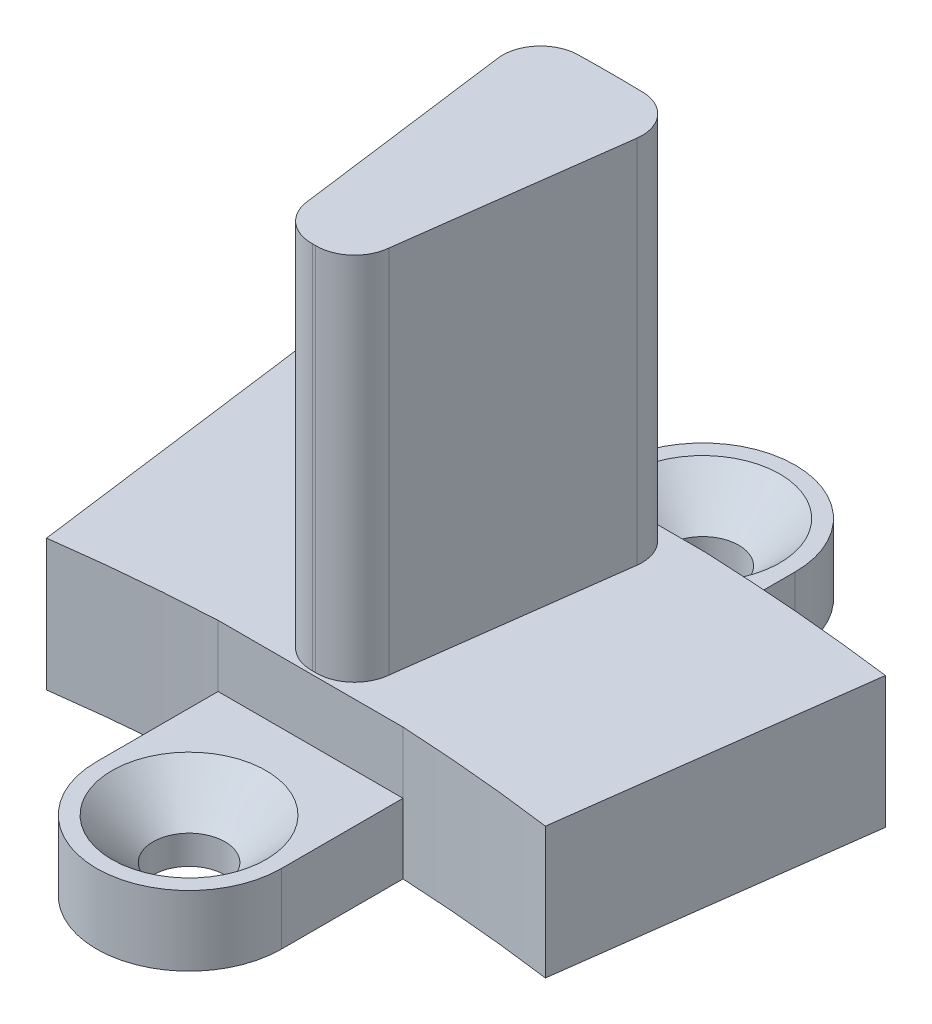
ISO-10303-21;
HEADER;
FILE_DESCRIPTION(('STEP AP214'),'2;1');
FILE_NAME('part.step','',(''),(''),'','','');
FILE_SCHEMA(('AUTOMOTIVE_DESIGN { 1 0 10303 214 1 1 1 1 }'));
ENDSEC;
DATA;
#1=APPLICATION_CONTEXT('core data for automotive mechanical design processes');
#2=APPLICATION_PROTOCOL_DEFINITION('international standard','automotive_design',2000,#1);
#3=PRODUCT_CONTEXT('',#1,'mechanical');
#4=PRODUCT('Part','Part','',(#3));
#5=PRODUCT_RELATED_PRODUCT_CATEGORY('part','',(#4));
#6=PRODUCT_DEFINITION_FORMATION('','',#4);
#7=PRODUCT_DEFINITION_CONTEXT('part definition',#1,'design');
#8=PRODUCT_DEFINITION('design','',#6,#7);
#9=PRODUCT_DEFINITION_SHAPE('','',#8);
#10=(LENGTH_UNIT() NAMED_UNIT(*) SI_UNIT(.MILLI.,.METRE.));
#11=(NAMED_UNIT(*) PLANE_ANGLE_UNIT() SI_UNIT($,.RADIAN.));
#12=(NAMED_UNIT(*) SI_UNIT($,.STERADIAN.) SOLID_ANGLE_UNIT());
#13=UNCERTAINTY_MEASURE_WITH_UNIT(LENGTH_MEASURE(1.E-05),#10,'distance_accuracy_value','');
#14=(GEOMETRIC_REPRESENTATION_CONTEXT(3) GLOBAL_UNCERTAINTY_ASSIGNED_CONTEXT((#13)) GLOBAL_UNIT_ASSIGNED_CONTEXT((#10,
#11,#12)) REPRESENTATION_CONTEXT('',''));
#15=CARTESIAN_POINT('',(0.,0.,0.));
#16=DIRECTION('',(0.,0.,1.));
#17=DIRECTION('',(1.,0.,0.));
#18=AXIS2_PLACEMENT_3D('',#15,#16,#17);
#19=CARTESIAN_POINT('',(0.,3.2,-87.));
#20=DIRECTION('',(0.,1.,0.));
#21=DIRECTION('',(0.,0.,1.));
#22=AXIS2_PLACEMENT_3D('',#19,#20,#21);
#23=PLANE('',#22);
#24=CARTESIAN_POINT('',(0.124377893297063,3.2,-94.9300631004996));
#25=DIRECTION('',(0.,1.,0.));
#26=DIRECTION('',(0.,0.,1.));
#27=AXIS2_PLACEMENT_3D('',#24,#25,#26);
#28=CIRCLE('',#27,1.85000000000024);
#29=CARTESIAN_POINT('',(0.0684906401915719,3.2,-93.080907451307));
#30=VERTEX_POINT('',#29);
#31=CARTESIAN_POINT('',(1.96660727060707,3.2,-94.760679153867));
#32=VERTEX_POINT('',#31);
#33=EDGE_CURVE('E59',#30,#32,#28,.T.);
#34=ORIENTED_EDGE('',*,*,#33,.F.);
#35=CARTESIAN_POINT('',(0.,3.2,7.16464999897995));
#36=DIRECTION('',(0.,1.,0.));
#37=DIRECTION('',(0.,0.,1.));
#38=AXIS2_PLACEMENT_3D('',#35,#36,#37);
#39=CIRCLE('',#38,100.245580847669);
#40=CARTESIAN_POINT('',(-0.0684906401915722,3.2,-93.080907451307));
#41=VERTEX_POINT('',#40);
#42=EDGE_CURVE('E728',#41,#30,#39,.F.);
#43=ORIENTED_EDGE('',*,*,#42,.F.);
#44=CARTESIAN_POINT('',(-0.119466178968226,3.2,-94.9520001694114));
#45=DIRECTION('',(0.,1.,0.));
#46=DIRECTION('',(0.,0.,1.));
#47=AXIS2_PLACEMENT_3D('',#44,#45,#46);
#48=CIRCLE('',#47,1.87178697113134);
#49=CARTESIAN_POINT('',(-1.98208086134192,3.2,-94.7669244813728));
#50=VERTEX_POINT('',#49);
#51=EDGE_CURVE('E725',#50,#41,#48,.T.);
#52=ORIENTED_EDGE('',*,*,#51,.F.);
#53=DIRECTION('',(0.130526192220048,0.,0.991444861373811));
#54=VECTOR('',#53,1.);
#55=CARTESIAN_POINT('',(-0.943197988726568,3.2,-86.8758256290647));
#56=LINE('',#55,#54);
#57=CARTESIAN_POINT('',(-3.38599627207303,3.2,-105.430720736352));
#58=VERTEX_POINT('',#57);
#59=EDGE_CURVE('E722',#58,#50,#56,.T.);
#60=ORIENTED_EDGE('',*,*,#59,.F.);
#61=CARTESIAN_POINT('',(-1.55,3.2,-105.657916002443));
#62=DIRECTION('',(0.,1.,0.));
#63=DIRECTION('',(0.,0.,1.));
#64=AXIS2_PLACEMENT_3D('',#61,#62,#63);
#65=CIRCLE('',#64,1.85);
#66=CARTESIAN_POINT('',(-1.63640185271201,3.2,-107.505897257718));
#67=VERTEX_POINT('',#66);
#68=EDGE_CURVE('E719',#67,#58,#65,.T.);
#69=ORIENTED_EDGE('',*,*,#68,.F.);
#70=CARTESIAN_POINT('',(0.,3.2,-34.9825728980639));
#71=DIRECTION('',(0.,1.,0.));
#72=DIRECTION('',(0.,0.,1.));
#73=AXIS2_PLACEMENT_3D('',#70,#71,#72);
#74=CIRCLE('',#73,72.5417837332328);
#75=CARTESIAN_POINT('',(1.63640185271204,3.2,-107.505897257718));
#76=VERTEX_POINT('',#75);
#77=EDGE_CURVE('E716',#76,#67,#74,.T.);
#78=ORIENTED_EDGE('',*,*,#77,.F.);
#79=CARTESIAN_POINT('',(1.53540433257632,3.2,-105.658656206602));
#80=DIRECTION('',(0.,1.,0.));
#81=DIRECTION('',(0.,0.,1.));
#82=AXIS2_PLACEMENT_3D('',#79,#80,#81);
#83=CIRCLE('',#82,1.85);
#84=CARTESIAN_POINT('',(3.37052268133818,3.2,-105.424475408846));
#85=VERTEX_POINT('',#84);
#86=EDGE_CURVE('E713',#85,#76,#83,.T.);
#87=ORIENTED_EDGE('',*,*,#86,.F.);
#88=DIRECTION('',(0.130526192220048,0.,-0.991444861373811));
#89=VECTOR('',#88,1.);
#90=CARTESIAN_POINT('',(0.928796227751736,3.2,-86.8777216568667));
#91=LINE('',#90,#89);
#92=EDGE_CURVE('E697',#32,#85,#91,.T.);
#93=ORIENTED_EDGE('',*,*,#92,.F.);
#94=EDGE_LOOP('',(#34,#43,#52,#60,#69,#78,#87,#93));
#95=FACE_BOUND('',#94,.T.);
#96=CARTESIAN_POINT('',(0.,3.2,-3.02676148835454));
#97=DIRECTION('',(0.,-1.,0.));
#98=DIRECTION('',(0.,0.,1.));
#99=AXIS2_PLACEMENT_3D('',#96,#97,#98);
#100=CIRCLE('',#99,90.);
#101=CARTESIAN_POINT('',(-12.1389358764648,3.2,-92.2043721077644));
#102=VERTEX_POINT('',#101);
#103=CARTESIAN_POINT('',(-4.49999999999997,3.2,-92.9141910878263));
#104=VERTEX_POINT('',#103);
#105=EDGE_CURVE('E619',#102,#104,#100,.T.);
#106=ORIENTED_EDGE('',*,*,#105,.T.);
#107=DIRECTION('',(1.,0.,0.));
#108=VECTOR('',#107,1.);
#109=CARTESIAN_POINT('',(0.,3.2,-92.9141910878263));
#110=LINE('',#109,#108);
#111=CARTESIAN_POINT('',(4.5,3.2,-92.9141910878264));
#112=VERTEX_POINT('',#111);
#113=EDGE_CURVE('E666',#104,#112,#110,.T.);
#114=ORIENTED_EDGE('',*,*,#113,.T.);
#115=CARTESIAN_POINT('',(0.,3.2,-3.02676148835454));
#116=DIRECTION('',(0.,-1.,0.));
#117=DIRECTION('',(0.,0.,1.));
#118=AXIS2_PLACEMENT_3D('',#115,#116,#117);
#119=CIRCLE('',#118,90.);
#120=CARTESIAN_POINT('',(12.1389358764648,3.2,-92.2043721077644));
#121=VERTEX_POINT('',#120);
#122=EDGE_CURVE('E217',#112,#121,#119,.T.);
#123=ORIENTED_EDGE('',*,*,#122,.T.);
#124=DIRECTION('',(0.130526192220052,0.,-0.99144486137381));
#125=VECTOR('',#124,1.);
#126=CARTESIAN_POINT('',(12.1389358764648,3.2,-92.2043721077644));
#127=LINE('',#126,#125);
#128=CARTESIAN_POINT('',(14.0641972117106,3.2,-106.828183813028));
#129=VERTEX_POINT('',#128);
#130=EDGE_CURVE('E590',#121,#129,#127,.T.);
#131=ORIENTED_EDGE('',*,*,#130,.T.);
#132=CARTESIAN_POINT('',(0.,3.2,2.26901301984254));
#133=DIRECTION('',(0.,1.,0.));
#134=DIRECTION('',(0.,0.,1.));
#135=AXIS2_PLACEMENT_3D('',#132,#133,#134);
#136=CIRCLE('',#135,110.);
#137=CARTESIAN_POINT('',(4.50000000000001,3.2,-107.6389029826));
#138=VERTEX_POINT('',#137);
#139=EDGE_CURVE('E660',#129,#138,#136,.T.);
#140=ORIENTED_EDGE('',*,*,#139,.T.);
#141=DIRECTION('',(-1.,0.,0.));
#142=VECTOR('',#141,1.);
#143=CARTESIAN_POINT('',(0.,3.2,-107.6389029826));
#144=LINE('',#143,#142);
#145=CARTESIAN_POINT('',(-4.5,3.2,-107.6389029826));
#146=VERTEX_POINT('',#145);
#147=EDGE_CURVE('E663',#138,#146,#144,.T.);
#148=ORIENTED_EDGE('',*,*,#147,.T.);
#149=CARTESIAN_POINT('',(0.,3.2,2.26901301984254));
#150=DIRECTION('',(0.,1.,0.));
#151=DIRECTION('',(0.,0.,1.));
#152=AXIS2_PLACEMENT_3D('',#149,#150,#151);
#153=CIRCLE('',#152,110.);
#154=CARTESIAN_POINT('',(-14.0641972117106,3.2,-106.828183813028));
#155=VERTEX_POINT('',#154);
#156=EDGE_CURVE('E643',#146,#155,#153,.T.);
#157=ORIENTED_EDGE('',*,*,#156,.T.);
#158=DIRECTION('',(0.130526192220052,0.,0.99144486137381));
#159=VECTOR('',#158,1.);
#160=CARTESIAN_POINT('',(-14.0641972117106,3.2,-106.828183813028));
#161=LINE('',#160,#159);
#162=EDGE_CURVE('E641',#155,#102,#161,.T.);
#163=ORIENTED_EDGE('',*,*,#162,.T.);
#164=EDGE_LOOP('',(#106,#114,#123,#131,#140,#148,#157,#163));
#165=FACE_BOUND('',#164,.T.);
#166=ADVANCED_FACE('F35',(#95,#165),#23,.T.);
#167=CARTESIAN_POINT('',(0.,3.2,-87.));
#168=DIRECTION('',(0.,-1.,0.));
#169=DIRECTION('',(0.,0.,-1.));
#170=AXIS2_PLACEMENT_3D('',#167,#168,#169);
#171=CYLINDRICAL_SURFACE('',#170,4.5);
#172=CARTESIAN_POINT('',(0.,0.2,-87.));
#173=DIRECTION('',(0.,1.,0.));
#174=DIRECTION('',(0.,0.,1.));
#175=AXIS2_PLACEMENT_3D('',#172,#173,#174);
#176=CIRCLE('',#175,4.5);
#177=CARTESIAN_POINT('',(-4.5,0.2,-87.));
#178=VERTEX_POINT('',#177);
#179=CARTESIAN_POINT('',(4.5,0.2,-87.));
#180=VERTEX_POINT('',#179);
#181=EDGE_CURVE('E191',#178,#180,#176,.T.);
#182=ORIENTED_EDGE('',*,*,#181,.F.);
#183=DIRECTION('',(0.,-1.,0.));
#184=VECTOR('',#183,1.);
#185=CARTESIAN_POINT('',(-4.5,3.2,-87.));
#186=LINE('',#185,#184);
#187=CARTESIAN_POINT('',(-4.5,-3.2,-87.));
#188=VERTEX_POINT('',#187);
#189=EDGE_CURVE('E616',#178,#188,#186,.T.);
#190=ORIENTED_EDGE('',*,*,#189,.T.);
#191=CARTESIAN_POINT('',(0.,-3.2,-87.));
#192=DIRECTION('',(0.,1.,0.));
#193=DIRECTION('',(0.,0.,1.));
#194=AXIS2_PLACEMENT_3D('',#191,#192,#193);
#195=CIRCLE('',#194,4.5);
#196=CARTESIAN_POINT('',(4.5,-3.2,-87.));
#197=VERTEX_POINT('',#196);
#198=EDGE_CURVE('E647',#188,#197,#195,.T.);
#199=ORIENTED_EDGE('',*,*,#198,.T.);
#200=DIRECTION('',(0.,-1.,0.));
#201=VECTOR('',#200,1.);
#202=CARTESIAN_POINT('',(4.5,3.2,-87.));
#203=LINE('',#202,#201);
#204=EDGE_CURVE('E218',#180,#197,#203,.T.);
#205=ORIENTED_EDGE('',*,*,#204,.F.);
#206=EDGE_LOOP('',(#182,#190,#199,#205));
#207=FACE_BOUND('',#206,.T.);
#208=ADVANCED_FACE('F244',(#207),#171,.T.);
#209=CARTESIAN_POINT('',(4.5,3.2,-90.6054837798056));
#210=DIRECTION('',(-1.,0.,0.));
#211=DIRECTION('',(0.,0.,1.));
#212=AXIS2_PLACEMENT_3D('',#209,#210,#211);
#213=PLANE('',#212);
#214=DIRECTION('',(0.,0.,-1.));
#215=VECTOR('',#214,1.);
#216=CARTESIAN_POINT('',(4.5,0.2,-87.0325559207924));
#217=LINE('',#216,#215);
#218=CARTESIAN_POINT('',(4.5,0.2,-92.9141910878264));
#219=VERTEX_POINT('',#218);
#220=EDGE_CURVE('E185',#180,#219,#217,.T.);
#221=ORIENTED_EDGE('',*,*,#220,.F.);
#222=ORIENTED_EDGE('',*,*,#204,.T.);
#223=DIRECTION('',(0.,0.,-1.));
#224=VECTOR('',#223,1.);
#225=CARTESIAN_POINT('',(4.5,-3.2,-90.6054837798056));
#226=LINE('',#225,#224);
#227=CARTESIAN_POINT('',(4.5,-3.2,-92.9141910878264));
#228=VERTEX_POINT('',#227);
#229=EDGE_CURVE('E209',#197,#228,#226,.T.);
#230=ORIENTED_EDGE('',*,*,#229,.T.);
#231=DIRECTION('',(0.,-1.,0.));
#232=VECTOR('',#231,1.);
#233=CARTESIAN_POINT('',(4.5,3.2,-92.9141910878264));
#234=LINE('',#233,#232);
#235=EDGE_CURVE('E206',#219,#228,#234,.T.);
#236=ORIENTED_EDGE('',*,*,#235,.F.);
#237=EDGE_LOOP('',(#221,#222,#230,#236));
#238=FACE_BOUND('',#237,.T.);
#239=ADVANCED_FACE('F207',(#238),#213,.F.);
#240=CARTESIAN_POINT('',(-4.5,3.2,-87.));
#241=DIRECTION('',(1.,0.,0.));
#242=DIRECTION('',(0.,0.,-1.));
#243=AXIS2_PLACEMENT_3D('',#240,#241,#242);
#244=PLANE('',#243);
#245=DIRECTION('',(0.,0.,1.));
#246=VECTOR('',#245,1.);
#247=CARTESIAN_POINT('',(-4.5,0.2,-91.3936529381923));
#248=LINE('',#247,#246);
#249=CARTESIAN_POINT('',(-4.49999999999997,0.2,-92.9141910878263));
#250=VERTEX_POINT('',#249);
#251=EDGE_CURVE('E203',#250,#178,#248,.T.);
#252=ORIENTED_EDGE('',*,*,#251,.F.);
#253=DIRECTION('',(0.,-1.,0.));
#254=VECTOR('',#253,1.);
#255=CARTESIAN_POINT('',(-4.49999999999997,3.2,-92.9141910878263));
#256=LINE('',#255,#254);
#257=CARTESIAN_POINT('',(-4.49999999999997,-3.2,-92.9141910878263));
#258=VERTEX_POINT('',#257);
#259=EDGE_CURVE('E618',#250,#258,#256,.T.);
#260=ORIENTED_EDGE('',*,*,#259,.T.);
#261=DIRECTION('',(0.,0.,1.));
#262=VECTOR('',#261,1.);
#263=CARTESIAN_POINT('',(-4.5,-3.2,-87.));
#264=LINE('',#263,#262);
#265=EDGE_CURVE('E613',#258,#188,#264,.T.);
#266=ORIENTED_EDGE('',*,*,#265,.T.);
#267=ORIENTED_EDGE('',*,*,#189,.F.);
#268=EDGE_LOOP('',(#252,#260,#266,#267));
#269=FACE_BOUND('',#268,.T.);
#270=ADVANCED_FACE('F260',(#269),#244,.F.);
#271=CARTESIAN_POINT('',(0.,3.2,-87.));
#272=DIRECTION('',(0.,-1.,0.));
#273=DIRECTION('',(0.,0.,-1.));
#274=AXIS2_PLACEMENT_3D('',#271,#272,#273);
#275=CYLINDRICAL_SURFACE('',#274,1.75);
#276=CARTESIAN_POINT('',(0.,-1.79999999999999,-87.));
#277=DIRECTION('',(0.,1.,0.));
#278=DIRECTION('',(0.,0.,1.));
#279=AXIS2_PLACEMENT_3D('',#276,#277,#278);
#280=CIRCLE('',#279,1.75);
#281=CARTESIAN_POINT('',(0.,-1.79999999999999,-85.25));
#282=VERTEX_POINT('',#281);
#283=EDGE_CURVE('E219',#282,#282,#280,.T.);
#284=ORIENTED_EDGE('',*,*,#283,.T.);
#285=EDGE_LOOP('',(#284));
#286=FACE_BOUND('',#285,.T.);
#287=CARTESIAN_POINT('',(0.,-3.2,-87.));
#288=DIRECTION('',(0.,1.,0.));
#289=DIRECTION('',(0.,0.,-1.));
#290=AXIS2_PLACEMENT_3D('',#287,#288,#289);
#291=CIRCLE('',#290,1.75);
#292=CARTESIAN_POINT('',(0.,-3.2,-88.75));
#293=VERTEX_POINT('',#292);
#294=EDGE_CURVE('E651',#293,#293,#291,.T.);
#295=ORIENTED_EDGE('',*,*,#294,.F.);
#296=EDGE_LOOP('',(#295));
#297=FACE_BOUND('',#296,.T.);
#298=ADVANCED_FACE('F258',(#286,#297),#275,.F.);
#299=CARTESIAN_POINT('',(0.,-3.2,-87.));
#300=DIRECTION('',(0.,1.,0.));
#301=DIRECTION('',(0.,0.,1.));
#302=AXIS2_PLACEMENT_3D('',#299,#300,#301);
#303=PLANE('',#302);
#304=ORIENTED_EDGE('',*,*,#198,.F.);
#305=ORIENTED_EDGE('',*,*,#265,.F.);
#306=CARTESIAN_POINT('',(0.,-3.2,-3.02676148835454));
#307=DIRECTION('',(0.,-1.,0.));
#308=DIRECTION('',(0.,0.,1.));
#309=AXIS2_PLACEMENT_3D('',#306,#307,#308);
#310=CIRCLE('',#309,90.);
#311=CARTESIAN_POINT('',(-12.1389358764648,-3.2,-92.2043721077644));
#312=VERTEX_POINT('',#311);
#313=EDGE_CURVE('E610',#312,#258,#310,.T.);
#314=ORIENTED_EDGE('',*,*,#313,.F.);
#315=DIRECTION('',(0.130526192220052,0.,0.99144486137381));
#316=VECTOR('',#315,1.);
#317=CARTESIAN_POINT('',(-14.0641972117106,-3.2,-106.828183813028));
#318=LINE('',#317,#316);
#319=CARTESIAN_POINT('',(-14.0641972117106,-3.2,-106.828183813028));
#320=VERTEX_POINT('',#319);
#321=EDGE_CURVE('E608',#320,#312,#318,.T.);
#322=ORIENTED_EDGE('',*,*,#321,.F.);
#323=CARTESIAN_POINT('',(0.,-3.2,2.26901301984254));
#324=DIRECTION('',(0.,1.,0.));
#325=DIRECTION('',(0.,0.,1.));
#326=AXIS2_PLACEMENT_3D('',#323,#324,#325);
#327=CIRCLE('',#326,110.);
#328=CARTESIAN_POINT('',(-4.5,-3.2,-107.6389029826));
#329=VERTEX_POINT('',#328);
#330=EDGE_CURVE('E606',#329,#320,#327,.T.);
#331=ORIENTED_EDGE('',*,*,#330,.F.);
#332=DIRECTION('',(0.,0.,1.));
#333=VECTOR('',#332,1.);
#334=CARTESIAN_POINT('',(-4.50000000000001,-3.2,-109.907916002443));
#335=LINE('',#334,#333);
#336=CARTESIAN_POINT('',(-4.5,-3.2,-112.));
#337=VERTEX_POINT('',#336);
#338=EDGE_CURVE('E603',#337,#329,#335,.T.);
#339=ORIENTED_EDGE('',*,*,#338,.F.);
#340=CARTESIAN_POINT('',(0.,-3.2,-112.));
#341=DIRECTION('',(0.,1.,0.));
#342=DIRECTION('',(0.,0.,-1.));
#343=AXIS2_PLACEMENT_3D('',#340,#341,#342);
#344=CIRCLE('',#343,4.5);
#345=CARTESIAN_POINT('',(4.5,-3.2,-112.));
#346=VERTEX_POINT('',#345);
#347=EDGE_CURVE('E601',#346,#337,#344,.T.);
#348=ORIENTED_EDGE('',*,*,#347,.F.);
#349=DIRECTION('',(0.,0.,-1.));
#350=VECTOR('',#349,1.);
#351=CARTESIAN_POINT('',(4.5,-3.2,-112.));
#352=LINE('',#351,#350);
#353=CARTESIAN_POINT('',(4.50000000000001,-3.2,-107.6389029826));
#354=VERTEX_POINT('',#353);
#355=EDGE_CURVE('E571',#354,#346,#352,.T.);
#356=ORIENTED_EDGE('',*,*,#355,.F.);
#357=CARTESIAN_POINT('',(0.,-3.2,2.26901301984254));
#358=DIRECTION('',(0.,1.,0.));
#359=DIRECTION('',(0.,0.,1.));
#360=AXIS2_PLACEMENT_3D('',#357,#358,#359);
#361=CIRCLE('',#360,110.);
#362=CARTESIAN_POINT('',(14.0641972117106,-3.2,-106.828183813028));
#363=VERTEX_POINT('',#362);
#364=EDGE_CURVE('E594',#363,#354,#361,.T.);
#365=ORIENTED_EDGE('',*,*,#364,.F.);
#366=DIRECTION('',(0.130526192220052,0.,-0.99144486137381));
#367=VECTOR('',#366,1.);
#368=CARTESIAN_POINT('',(12.1389358764648,-3.2,-92.2043721077644));
#369=LINE('',#368,#367);
#370=CARTESIAN_POINT('',(12.1389358764648,-3.2,-92.2043721077644));
#371=VERTEX_POINT('',#370);
#372=EDGE_CURVE('E589',#371,#363,#369,.T.);
#373=ORIENTED_EDGE('',*,*,#372,.F.);
#374=CARTESIAN_POINT('',(0.,-3.2,-3.02676148835454));
#375=DIRECTION('',(0.,-1.,0.));
#376=DIRECTION('',(0.,0.,1.));
#377=AXIS2_PLACEMENT_3D('',#374,#375,#376);
#378=CIRCLE('',#377,90.);
#379=EDGE_CURVE('E593',#228,#371,#378,.T.);
#380=ORIENTED_EDGE('',*,*,#379,.F.);
#381=ORIENTED_EDGE('',*,*,#229,.F.);
#382=EDGE_LOOP('',(#304,#305,#314,#322,#331,#339,#348,#356,#365,#373,#380,#381));
#383=FACE_BOUND('',#382,.T.);
#384=CARTESIAN_POINT('',(0.,-3.2,-112.));
#385=DIRECTION('',(0.,1.,0.));
#386=DIRECTION('',(0.,0.,1.));
#387=AXIS2_PLACEMENT_3D('',#384,#385,#386);
#388=CIRCLE('',#387,1.75);
#389=CARTESIAN_POINT('',(0.,-3.2,-110.25));
#390=VERTEX_POINT('',#389);
#391=EDGE_CURVE('E649',#390,#390,#388,.T.);
#392=ORIENTED_EDGE('',*,*,#391,.T.);
#393=EDGE_LOOP('',(#392));
#394=FACE_BOUND('',#393,.T.);
#395=ORIENTED_EDGE('',*,*,#294,.T.);
#396=EDGE_LOOP('',(#395));
#397=FACE_BOUND('',#396,.T.);
#398=ADVANCED_FACE('F255',(#383,#394,#397),#303,.F.);
#399=CARTESIAN_POINT('',(0.,3.2,-3.02676148835454));
#400=DIRECTION('',(0.,-1.,0.));
#401=DIRECTION('',(0.,0.,-1.));
#402=AXIS2_PLACEMENT_3D('',#399,#400,#401);
#403=CYLINDRICAL_SURFACE('',#402,90.);
#404=ORIENTED_EDGE('',*,*,#379,.T.);
#405=DIRECTION('',(0.,-1.,0.));
#406=VECTOR('',#405,1.);
#407=CARTESIAN_POINT('',(12.1389358764648,3.2,-92.2043721077644));
#408=LINE('',#407,#406);
#409=EDGE_CURVE('E212',#121,#371,#408,.T.);
#410=ORIENTED_EDGE('',*,*,#409,.F.);
#411=ORIENTED_EDGE('',*,*,#122,.F.);
#412=EDGE_CURVE('E199',#112,#219,#234,.T.);
#413=ORIENTED_EDGE('',*,*,#412,.T.);
#414=ORIENTED_EDGE('',*,*,#235,.T.);
#415=EDGE_LOOP('',(#404,#410,#411,#413,#414));
#416=FACE_BOUND('',#415,.T.);
#417=ADVANCED_FACE('F215',(#416),#403,.F.);
#418=CARTESIAN_POINT('',(12.1389358764648,3.2,-92.2043721077644));
#419=DIRECTION('',(-0.99144486137381,0.,-0.130526192220052));
#420=DIRECTION('',(-0.130526192220052,0.,0.99144486137381));
#421=AXIS2_PLACEMENT_3D('',#418,#419,#420);
#422=PLANE('',#421);
#423=ORIENTED_EDGE('',*,*,#372,.T.);
#424=DIRECTION('',(0.,-1.,0.));
#425=VECTOR('',#424,1.);
#426=CARTESIAN_POINT('',(14.0641972117106,3.2,-106.828183813028));
#427=LINE('',#426,#425);
#428=EDGE_CURVE('E580',#129,#363,#427,.T.);
#429=ORIENTED_EDGE('',*,*,#428,.F.);
#430=ORIENTED_EDGE('',*,*,#130,.F.);
#431=ORIENTED_EDGE('',*,*,#409,.T.);
#432=EDGE_LOOP('',(#423,#429,#430,#431));
#433=FACE_BOUND('',#432,.T.);
#434=ADVANCED_FACE('F291',(#433),#422,.F.);
#435=CARTESIAN_POINT('',(0.,3.2,2.26901301984254));
#436=DIRECTION('',(0.,-1.,0.));
#437=DIRECTION('',(0.,0.,-1.));
#438=AXIS2_PLACEMENT_3D('',#435,#436,#437);
#439=CYLINDRICAL_SURFACE('',#438,110.);
#440=ORIENTED_EDGE('',*,*,#364,.T.);
#441=DIRECTION('',(0.,-1.,0.));
#442=VECTOR('',#441,1.);
#443=CARTESIAN_POINT('',(4.50000000000001,3.2,-107.6389029826));
#444=LINE('',#443,#442);
#445=CARTESIAN_POINT('',(4.50000000000001,0.2,-107.6389029826));
#446=VERTEX_POINT('',#445);
#447=EDGE_CURVE('E573',#446,#354,#444,.T.);
#448=ORIENTED_EDGE('',*,*,#447,.F.);
#449=EDGE_CURVE('E575',#138,#446,#444,.T.);
#450=ORIENTED_EDGE('',*,*,#449,.F.);
#451=ORIENTED_EDGE('',*,*,#139,.F.);
#452=ORIENTED_EDGE('',*,*,#428,.T.);
#453=EDGE_LOOP('',(#440,#448,#450,#451,#452));
#454=FACE_BOUND('',#453,.T.);
#455=ADVANCED_FACE('F287',(#454),#439,.T.);
#456=CARTESIAN_POINT('',(4.5,3.2,-112.));
#457=DIRECTION('',(-1.,0.,0.));
#458=DIRECTION('',(0.,0.,1.));
#459=AXIS2_PLACEMENT_3D('',#456,#457,#458);
#460=PLANE('',#459);
#461=DIRECTION('',(0.,-1.,0.));
#462=VECTOR('',#461,1.);
#463=CARTESIAN_POINT('',(4.5,3.2,-112.));
#464=LINE('',#463,#462);
#465=CARTESIAN_POINT('',(4.5,0.2,-112.));
#466=VERTEX_POINT('',#465);
#467=EDGE_CURVE('E565',#466,#346,#464,.T.);
#468=ORIENTED_EDGE('',*,*,#467,.F.);
#469=DIRECTION('',(0.,0.,-1.));
#470=VECTOR('',#469,1.);
#471=CARTESIAN_POINT('',(4.5,0.2,-112.));
#472=LINE('',#471,#470);
#473=EDGE_CURVE('E556',#446,#466,#472,.T.);
#474=ORIENTED_EDGE('',*,*,#473,.F.);
#475=ORIENTED_EDGE('',*,*,#447,.T.);
#476=ORIENTED_EDGE('',*,*,#355,.T.);
#477=EDGE_LOOP('',(#468,#474,#475,#476));
#478=FACE_BOUND('',#477,.T.);
#479=ADVANCED_FACE('F283',(#478),#460,.F.);
#480=CARTESIAN_POINT('',(0.,3.2,-112.));
#481=DIRECTION('',(0.,-1.,0.));
#482=DIRECTION('',(0.,0.,-1.));
#483=AXIS2_PLACEMENT_3D('',#480,#481,#482);
#484=CYLINDRICAL_SURFACE('',#483,4.5);
#485=DIRECTION('',(0.,-1.,0.));
#486=VECTOR('',#485,1.);
#487=CARTESIAN_POINT('',(-4.5,3.2,-112.));
#488=LINE('',#487,#486);
#489=CARTESIAN_POINT('',(-4.5,0.2,-112.));
#490=VERTEX_POINT('',#489);
#491=EDGE_CURVE('E567',#490,#337,#488,.T.);
#492=ORIENTED_EDGE('',*,*,#491,.F.);
#493=CARTESIAN_POINT('',(0.,0.2,-112.));
#494=DIRECTION('',(0.,1.,0.));
#495=DIRECTION('',(0.,0.,-1.));
#496=AXIS2_PLACEMENT_3D('',#493,#494,#495);
#497=CIRCLE('',#496,4.5);
#498=EDGE_CURVE('E558',#466,#490,#497,.T.);
#499=ORIENTED_EDGE('',*,*,#498,.F.);
#500=ORIENTED_EDGE('',*,*,#467,.T.);
#501=ORIENTED_EDGE('',*,*,#347,.T.);
#502=EDGE_LOOP('',(#492,#499,#500,#501));
#503=FACE_BOUND('',#502,.T.);
#504=ADVANCED_FACE('F279',(#503),#484,.T.);
#505=CARTESIAN_POINT('',(-4.50000000000001,3.2,-109.907916002443));
#506=DIRECTION('',(1.,0.,0.));
#507=DIRECTION('',(0.,0.,-1.));
#508=AXIS2_PLACEMENT_3D('',#505,#506,#507);
#509=PLANE('',#508);
#510=DIRECTION('',(0.,-1.,0.));
#511=VECTOR('',#510,1.);
#512=CARTESIAN_POINT('',(-4.5,3.2,-107.6389029826));
#513=LINE('',#512,#511);
#514=CARTESIAN_POINT('',(-4.5,0.2,-107.6389029826));
#515=VERTEX_POINT('',#514);
#516=EDGE_CURVE('E626',#515,#329,#513,.T.);
#517=ORIENTED_EDGE('',*,*,#516,.F.);
#518=DIRECTION('',(0.,0.,1.));
#519=VECTOR('',#518,1.);
#520=CARTESIAN_POINT('',(-4.5,0.2,-107.6389029826));
#521=LINE('',#520,#519);
#522=EDGE_CURVE('E568',#490,#515,#521,.T.);
#523=ORIENTED_EDGE('',*,*,#522,.F.);
#524=ORIENTED_EDGE('',*,*,#491,.T.);
#525=ORIENTED_EDGE('',*,*,#338,.T.);
#526=EDGE_LOOP('',(#517,#523,#524,#525));
#527=FACE_BOUND('',#526,.T.);
#528=ADVANCED_FACE('F275',(#527),#509,.F.);
#529=CARTESIAN_POINT('',(0.,3.2,2.26901301984254));
#530=DIRECTION('',(0.,-1.,0.));
#531=DIRECTION('',(0.,0.,-1.));
#532=AXIS2_PLACEMENT_3D('',#529,#530,#531);
#533=CYLINDRICAL_SURFACE('',#532,110.);
#534=ORIENTED_EDGE('',*,*,#330,.T.);
#535=DIRECTION('',(0.,-1.,0.));
#536=VECTOR('',#535,1.);
#537=CARTESIAN_POINT('',(-14.0641972117106,3.2,-106.828183813028));
#538=LINE('',#537,#536);
#539=EDGE_CURVE('E624',#155,#320,#538,.T.);
#540=ORIENTED_EDGE('',*,*,#539,.F.);
#541=ORIENTED_EDGE('',*,*,#156,.F.);
#542=EDGE_CURVE('E577',#146,#515,#513,.T.);
#543=ORIENTED_EDGE('',*,*,#542,.T.);
#544=ORIENTED_EDGE('',*,*,#516,.T.);
#545=EDGE_LOOP('',(#534,#540,#541,#543,#544));
#546=FACE_BOUND('',#545,.T.);
#547=ADVANCED_FACE('F271',(#546),#533,.T.);
#548=CARTESIAN_POINT('',(-14.0641972117106,3.2,-106.828183813028));
#549=DIRECTION('',(0.99144486137381,0.,-0.130526192220052));
#550=DIRECTION('',(-0.130526192220052,0.,-0.99144486137381));
#551=AXIS2_PLACEMENT_3D('',#548,#549,#550);
#552=PLANE('',#551);
#553=ORIENTED_EDGE('',*,*,#321,.T.);
#554=DIRECTION('',(0.,-1.,0.));
#555=VECTOR('',#554,1.);
#556=CARTESIAN_POINT('',(-12.1389358764648,3.2,-92.2043721077644));
#557=LINE('',#556,#555);
#558=EDGE_CURVE('E621',#102,#312,#557,.T.);
#559=ORIENTED_EDGE('',*,*,#558,.F.);
#560=ORIENTED_EDGE('',*,*,#162,.F.);
#561=ORIENTED_EDGE('',*,*,#539,.T.);
#562=EDGE_LOOP('',(#553,#559,#560,#561));
#563=FACE_BOUND('',#562,.T.);
#564=ADVANCED_FACE('F267',(#563),#552,.F.);
#565=CARTESIAN_POINT('',(0.,3.2,-3.02676148835454));
#566=DIRECTION('',(0.,-1.,0.));
#567=DIRECTION('',(0.,0.,-1.));
#568=AXIS2_PLACEMENT_3D('',#565,#566,#567);
#569=CYLINDRICAL_SURFACE('',#568,90.);
#570=ORIENTED_EDGE('',*,*,#313,.T.);
#571=ORIENTED_EDGE('',*,*,#259,.F.);
#572=EDGE_CURVE('E202',#104,#250,#256,.T.);
#573=ORIENTED_EDGE('',*,*,#572,.F.);
#574=ORIENTED_EDGE('',*,*,#105,.F.);
#575=ORIENTED_EDGE('',*,*,#558,.T.);
#576=EDGE_LOOP('',(#570,#571,#573,#574,#575));
#577=FACE_BOUND('',#576,.T.);
#578=ADVANCED_FACE('F264',(#577),#569,.F.);
#579=CARTESIAN_POINT('',(0.,3.2,-112.));
#580=DIRECTION('',(0.,-1.,0.));
#581=DIRECTION('',(0.,0.,-1.));
#582=AXIS2_PLACEMENT_3D('',#579,#580,#581);
#583=CYLINDRICAL_SURFACE('',#582,1.75);
#584=CARTESIAN_POINT('',(0.,-1.79999999999999,-112.));
#585=DIRECTION('',(0.,-1.,0.));
#586=DIRECTION('',(0.,0.,-1.));
#587=AXIS2_PLACEMENT_3D('',#584,#585,#586);
#588=CIRCLE('',#587,1.75);
#589=CARTESIAN_POINT('',(0.,-1.79999999999999,-113.75));
#590=VERTEX_POINT('',#589);
#591=EDGE_CURVE('E44',#590,#590,#588,.F.);
#592=ORIENTED_EDGE('',*,*,#591,.T.);
#593=EDGE_LOOP('',(#592));
#594=FACE_BOUND('',#593,.T.);
#595=ORIENTED_EDGE('',*,*,#391,.F.);
#596=EDGE_LOOP('',(#595));
#597=FACE_BOUND('',#596,.T.);
#598=ADVANCED_FACE('F231',(#594,#597),#583,.F.);
#599=CARTESIAN_POINT('',(0.124377893297063,-19.1586756205012,-94.9300631004996));
#600=DIRECTION('',(0.,1.,0.));
#601=DIRECTION('',(0.,0.,1.));
#602=AXIS2_PLACEMENT_3D('',#599,#600,#601);
#603=CYLINDRICAL_SURFACE('',#602,1.85000000000024);
#604=DIRECTION('',(0.,1.,0.));
#605=VECTOR('',#604,1.);
#606=CARTESIAN_POINT('',(0.0684906401915719,-19.1586756205012,-93.080907451307));
#607=LINE('',#606,#605);
#608=CARTESIAN_POINT('',(0.0684906401915719,21.2,-93.080907451307));
#609=VERTEX_POINT('',#608);
#610=EDGE_CURVE('E695',#30,#609,#607,.T.);
#611=ORIENTED_EDGE('',*,*,#610,.F.);
#612=ORIENTED_EDGE('',*,*,#33,.T.);
#613=DIRECTION('',(0.,1.,0.));
#614=VECTOR('',#613,1.);
#615=CARTESIAN_POINT('',(1.96660727060707,-19.1586756205012,-94.760679153867));
#616=LINE('',#615,#614);
#617=CARTESIAN_POINT('',(1.96660727060707,21.2,-94.760679153867));
#618=VERTEX_POINT('',#617);
#619=EDGE_CURVE('E694',#32,#618,#616,.T.);
#620=ORIENTED_EDGE('',*,*,#619,.T.);
#621=CARTESIAN_POINT('',(0.124377893297063,21.2,-94.9300631004996));
#622=DIRECTION('',(0.,1.,0.));
#623=DIRECTION('',(0.,0.,1.));
#624=AXIS2_PLACEMENT_3D('',#621,#622,#623);
#625=CIRCLE('',#624,1.85000000000024);
#626=EDGE_CURVE('E665',#609,#618,#625,.T.);
#627=ORIENTED_EDGE('',*,*,#626,.F.);
#628=EDGE_LOOP('',(#611,#612,#620,#627));
#629=FACE_BOUND('',#628,.T.);
#630=ADVANCED_FACE('F367',(#629),#603,.T.);
#631=CARTESIAN_POINT('',(0.,-19.1586756205012,7.16464999897995));
#632=DIRECTION('',(0.,1.,0.));
#633=DIRECTION('',(0.,0.,1.));
#634=AXIS2_PLACEMENT_3D('',#631,#632,#633);
#635=CYLINDRICAL_SURFACE('',#634,100.245580847669);
#636=DIRECTION('',(0.,1.,0.));
#637=VECTOR('',#636,1.);
#638=CARTESIAN_POINT('',(-0.0684906401915721,-19.1586756205012,-93.080907451307));
#639=LINE('',#638,#637);
#640=CARTESIAN_POINT('',(-0.0684906401915721,21.2,-93.080907451307));
#641=VERTEX_POINT('',#640);
#642=EDGE_CURVE('E698',#41,#641,#639,.T.);
#643=ORIENTED_EDGE('',*,*,#642,.F.);
#644=ORIENTED_EDGE('',*,*,#42,.T.);
#645=ORIENTED_EDGE('',*,*,#610,.T.);
#646=CARTESIAN_POINT('',(0.,21.2,7.16464999897995));
#647=DIRECTION('',(0.,-1.,0.));
#648=DIRECTION('',(0.,0.,1.));
#649=AXIS2_PLACEMENT_3D('',#646,#647,#648);
#650=CIRCLE('',#649,100.245580847669);
#651=EDGE_CURVE('E691',#641,#609,#650,.T.);
#652=ORIENTED_EDGE('',*,*,#651,.F.);
#653=EDGE_LOOP('',(#643,#644,#645,#652));
#654=FACE_BOUND('',#653,.T.);
#655=ADVANCED_FACE('F373',(#654),#635,.F.);
#656=CARTESIAN_POINT('',(-0.119466178968226,-19.1586756205012,-94.9520001694114));
#657=DIRECTION('',(0.,1.,0.));
#658=DIRECTION('',(0.,0.,1.));
#659=AXIS2_PLACEMENT_3D('',#656,#657,#658);
#660=CYLINDRICAL_SURFACE('',#659,1.87178697113134);
#661=DIRECTION('',(0.,1.,0.));
#662=VECTOR('',#661,1.);
#663=CARTESIAN_POINT('',(-1.98208086134192,-19.1586756205012,-94.7669244813728));
#664=LINE('',#663,#662);
#665=CARTESIAN_POINT('',(-1.98208086134192,21.2,-94.7669244813728));
#666=VERTEX_POINT('',#665);
#667=EDGE_CURVE('E700',#50,#666,#664,.T.);
#668=ORIENTED_EDGE('',*,*,#667,.F.);
#669=ORIENTED_EDGE('',*,*,#51,.T.);
#670=ORIENTED_EDGE('',*,*,#642,.T.);
#671=CARTESIAN_POINT('',(-0.119466178968226,21.2,-94.9520001694114));
#672=DIRECTION('',(0.,1.,0.));
#673=DIRECTION('',(0.,0.,1.));
#674=AXIS2_PLACEMENT_3D('',#671,#672,#673);
#675=CIRCLE('',#674,1.87178697113134);
#676=EDGE_CURVE('E688',#666,#641,#675,.T.);
#677=ORIENTED_EDGE('',*,*,#676,.F.);
#678=EDGE_LOOP('',(#668,#669,#670,#677));
#679=FACE_BOUND('',#678,.T.);
#680=ADVANCED_FACE('F381',(#679),#660,.T.);
#681=CARTESIAN_POINT('',(-3.38599627207303,-19.1586756205012,-105.430720736352));
#682=DIRECTION('',(-0.991444861373811,0.,0.130526192220048));
#683=DIRECTION('',(0.130526192220048,0.,0.991444861373811));
#684=AXIS2_PLACEMENT_3D('',#681,#682,#683);
#685=PLANE('',#684);
#686=DIRECTION('',(0.,1.,0.));
#687=VECTOR('',#686,1.);
#688=CARTESIAN_POINT('',(-3.38599627207303,-19.1586756205012,-105.430720736352));
#689=LINE('',#688,#687);
#690=CARTESIAN_POINT('',(-3.38599627207303,21.2,-105.430720736352));
#691=VERTEX_POINT('',#690);
#692=EDGE_CURVE('E702',#58,#691,#689,.T.);
#693=ORIENTED_EDGE('',*,*,#692,.F.);
#694=ORIENTED_EDGE('',*,*,#59,.T.);
#695=ORIENTED_EDGE('',*,*,#667,.T.);
#696=DIRECTION('',(0.130526192220047,0.,0.991444861373811));
#697=VECTOR('',#696,1.);
#698=CARTESIAN_POINT('',(-3.38599627207303,21.2,-105.430720736352));
#699=LINE('',#698,#697);
#700=EDGE_CURVE('E685',#691,#666,#699,.T.);
#701=ORIENTED_EDGE('',*,*,#700,.F.);
#702=EDGE_LOOP('',(#693,#694,#695,#701));
#703=FACE_BOUND('',#702,.T.);
#704=ADVANCED_FACE('F389',(#703),#685,.T.);
#705=CARTESIAN_POINT('',(-1.55,-19.1586756205012,-105.657916002443));
#706=DIRECTION('',(0.,1.,0.));
#707=DIRECTION('',(0.,0.,1.));
#708=AXIS2_PLACEMENT_3D('',#705,#706,#707);
#709=CYLINDRICAL_SURFACE('',#708,1.85);
#710=DIRECTION('',(0.,1.,0.));
#711=VECTOR('',#710,1.);
#712=CARTESIAN_POINT('',(-1.63640185271201,-19.1586756205012,-107.505897257718));
#713=LINE('',#712,#711);
#714=CARTESIAN_POINT('',(-1.63640185271201,21.2,-107.505897257718));
#715=VERTEX_POINT('',#714);
#716=EDGE_CURVE('E704',#67,#715,#713,.T.);
#717=ORIENTED_EDGE('',*,*,#716,.F.);
#718=ORIENTED_EDGE('',*,*,#68,.T.);
#719=ORIENTED_EDGE('',*,*,#692,.T.);
#720=CARTESIAN_POINT('',(-1.55,21.2,-105.657916002443));
#721=DIRECTION('',(0.,1.,0.));
#722=DIRECTION('',(0.,0.,1.));
#723=AXIS2_PLACEMENT_3D('',#720,#721,#722);
#724=CIRCLE('',#723,1.85);
#725=EDGE_CURVE('E682',#715,#691,#724,.T.);
#726=ORIENTED_EDGE('',*,*,#725,.F.);
#727=EDGE_LOOP('',(#717,#718,#719,#726));
#728=FACE_BOUND('',#727,.T.);
#729=ADVANCED_FACE('F397',(#728),#709,.T.);
#730=CARTESIAN_POINT('',(0.,-19.1586756205012,-34.9825728980639));
#731=DIRECTION('',(0.,1.,0.));
#732=DIRECTION('',(0.,0.,1.));
#733=AXIS2_PLACEMENT_3D('',#730,#731,#732);
#734=CYLINDRICAL_SURFACE('',#733,72.5417837332328);
#735=DIRECTION('',(0.,1.,0.));
#736=VECTOR('',#735,1.);
#737=CARTESIAN_POINT('',(1.63640185271204,-19.1586756205012,-107.505897257718));
#738=LINE('',#737,#736);
#739=CARTESIAN_POINT('',(1.63640185271204,21.2,-107.505897257718));
#740=VERTEX_POINT('',#739);
#741=EDGE_CURVE('E706',#76,#740,#738,.T.);
#742=ORIENTED_EDGE('',*,*,#741,.F.);
#743=ORIENTED_EDGE('',*,*,#77,.T.);
#744=ORIENTED_EDGE('',*,*,#716,.T.);
#745=CARTESIAN_POINT('',(0.,21.2,-34.9825728980639));
#746=DIRECTION('',(0.,1.,0.));
#747=DIRECTION('',(0.,0.,1.));
#748=AXIS2_PLACEMENT_3D('',#745,#746,#747);
#749=CIRCLE('',#748,72.5417837332328);
#750=EDGE_CURVE('E679',#740,#715,#749,.T.);
#751=ORIENTED_EDGE('',*,*,#750,.F.);
#752=EDGE_LOOP('',(#742,#743,#744,#751));
#753=FACE_BOUND('',#752,.T.);
#754=ADVANCED_FACE('F405',(#753),#734,.T.);
#755=CARTESIAN_POINT('',(1.53540433257632,-19.1586756205012,-105.658656206602));
#756=DIRECTION('',(0.,1.,0.));
#757=DIRECTION('',(0.,0.,1.));
#758=AXIS2_PLACEMENT_3D('',#755,#756,#757);
#759=CYLINDRICAL_SURFACE('',#758,1.85);
#760=DIRECTION('',(0.,1.,0.));
#761=VECTOR('',#760,1.);
#762=CARTESIAN_POINT('',(3.37052268133818,-19.1586756205012,-105.424475408846));
#763=LINE('',#762,#761);
#764=CARTESIAN_POINT('',(3.37052268133818,21.2,-105.424475408846));
#765=VERTEX_POINT('',#764);
#766=EDGE_CURVE('E708',#85,#765,#763,.T.);
#767=ORIENTED_EDGE('',*,*,#766,.F.);
#768=ORIENTED_EDGE('',*,*,#86,.T.);
#769=ORIENTED_EDGE('',*,*,#741,.T.);
#770=CARTESIAN_POINT('',(1.53540433257632,21.2,-105.658656206602));
#771=DIRECTION('',(0.,1.,0.));
#772=DIRECTION('',(0.,0.,1.));
#773=AXIS2_PLACEMENT_3D('',#770,#771,#772);
#774=CIRCLE('',#773,1.85);
#775=EDGE_CURVE('E676',#765,#740,#774,.T.);
#776=ORIENTED_EDGE('',*,*,#775,.F.);
#777=EDGE_LOOP('',(#767,#768,#769,#776));
#778=FACE_BOUND('',#777,.T.);
#779=ADVANCED_FACE('F413',(#778),#759,.T.);
#780=CARTESIAN_POINT('',(1.96660727060707,-19.1586756205012,-94.760679153867));
#781=DIRECTION('',(0.991444861373811,0.,0.130526192220048));
#782=DIRECTION('',(0.130526192220048,0.,-0.991444861373811));
#783=AXIS2_PLACEMENT_3D('',#780,#781,#782);
#784=PLANE('',#783);
#785=ORIENTED_EDGE('',*,*,#619,.F.);
#786=ORIENTED_EDGE('',*,*,#92,.T.);
#787=ORIENTED_EDGE('',*,*,#766,.T.);
#788=DIRECTION('',(0.130526192220048,0.,-0.991444861373811));
#789=VECTOR('',#788,1.);
#790=CARTESIAN_POINT('',(1.96660727060707,21.2,-94.760679153867));
#791=LINE('',#790,#789);
#792=EDGE_CURVE('E669',#618,#765,#791,.T.);
#793=ORIENTED_EDGE('',*,*,#792,.F.);
#794=EDGE_LOOP('',(#785,#786,#787,#793));
#795=FACE_BOUND('',#794,.T.);
#796=ADVANCED_FACE('F421',(#795),#784,.T.);
#797=CARTESIAN_POINT('',(0.124377893297063,21.2,-94.9300631004996));
#798=DIRECTION('',(0.,1.,0.));
#799=DIRECTION('',(0.,0.,1.));
#800=AXIS2_PLACEMENT_3D('',#797,#798,#799);
#801=PLANE('',#800);
#802=ORIENTED_EDGE('',*,*,#626,.T.);
#803=ORIENTED_EDGE('',*,*,#792,.T.);
#804=ORIENTED_EDGE('',*,*,#775,.T.);
#805=ORIENTED_EDGE('',*,*,#750,.T.);
#806=ORIENTED_EDGE('',*,*,#725,.T.);
#807=ORIENTED_EDGE('',*,*,#700,.T.);
#808=ORIENTED_EDGE('',*,*,#676,.T.);
#809=ORIENTED_EDGE('',*,*,#651,.T.);
#810=EDGE_LOOP('',(#802,#803,#804,#805,#806,#807,#808,#809));
#811=FACE_BOUND('',#810,.T.);
#812=ADVANCED_FACE('F429',(#811),#801,.T.);
#813=CARTESIAN_POINT('',(0.,0.2,-86.9177888791116));
#814=DIRECTION('',(0.,1.,0.));
#815=DIRECTION('',(0.,0.,1.));
#816=AXIS2_PLACEMENT_3D('',#813,#814,#815);
#817=PLANE('',#816);
#818=CARTESIAN_POINT('',(0.,0.2,-87.));
#819=DIRECTION('',(0.,1.,0.));
#820=DIRECTION('',(0.,0.,1.));
#821=AXIS2_PLACEMENT_3D('',#818,#819,#820);
#822=CIRCLE('',#821,3.74999999999999);
#823=CARTESIAN_POINT('',(0.,0.2,-83.25));
#824=VERTEX_POINT('',#823);
#825=EDGE_CURVE('E226',#824,#824,#822,.F.);
#826=ORIENTED_EDGE('',*,*,#825,.T.);
#827=EDGE_LOOP('',(#826));
#828=FACE_BOUND('',#827,.T.);
#829=ORIENTED_EDGE('',*,*,#181,.T.);
#830=ORIENTED_EDGE('',*,*,#220,.T.);
#831=DIRECTION('',(-1.,0.,0.));
#832=VECTOR('',#831,1.);
#833=CARTESIAN_POINT('',(-4.49999999999997,0.2,-92.9141910878263));
#834=LINE('',#833,#832);
#835=EDGE_CURVE('E188',#219,#250,#834,.T.);
#836=ORIENTED_EDGE('',*,*,#835,.T.);
#837=ORIENTED_EDGE('',*,*,#251,.T.);
#838=EDGE_LOOP('',(#829,#830,#836,#837));
#839=FACE_BOUND('',#838,.T.);
#840=ADVANCED_FACE('F187',(#828,#839),#817,.T.);
#841=CARTESIAN_POINT('',(-4.49999999999997,21.2,-92.9141910878263));
#842=DIRECTION('',(0.,0.,1.));
#843=DIRECTION('',(1.,0.,0.));
#844=AXIS2_PLACEMENT_3D('',#841,#842,#843);
#845=PLANE('',#844);
#846=ORIENTED_EDGE('',*,*,#572,.T.);
#847=ORIENTED_EDGE('',*,*,#835,.F.);
#848=ORIENTED_EDGE('',*,*,#412,.F.);
#849=ORIENTED_EDGE('',*,*,#113,.F.);
#850=EDGE_LOOP('',(#846,#847,#848,#849));
#851=FACE_BOUND('',#850,.T.);
#852=ADVANCED_FACE('F197',(#851),#845,.T.);
#853=CARTESIAN_POINT('',(4.50000000000001,21.2,-107.6389029826));
#854=DIRECTION('',(0.,0.,-1.));
#855=DIRECTION('',(-1.,0.,0.));
#856=AXIS2_PLACEMENT_3D('',#853,#854,#855);
#857=PLANE('',#856);
#858=ORIENTED_EDGE('',*,*,#449,.T.);
#859=DIRECTION('',(1.,0.,0.));
#860=VECTOR('',#859,1.);
#861=CARTESIAN_POINT('',(4.50000000000001,0.2,-107.6389029826));
#862=LINE('',#861,#860);
#863=EDGE_CURVE('E51',#515,#446,#862,.T.);
#864=ORIENTED_EDGE('',*,*,#863,.F.);
#865=ORIENTED_EDGE('',*,*,#542,.F.);
#866=ORIENTED_EDGE('',*,*,#147,.F.);
#867=EDGE_LOOP('',(#858,#864,#865,#866));
#868=FACE_BOUND('',#867,.T.);
#869=ADVANCED_FACE('F450',(#868),#857,.T.);
#870=CARTESIAN_POINT('',(0.,0.2,-112.));
#871=DIRECTION('',(0.,-1.,0.));
#872=DIRECTION('',(0.,0.,-1.));
#873=AXIS2_PLACEMENT_3D('',#870,#871,#872);
#874=PLANE('',#873);
#875=CARTESIAN_POINT('',(0.,0.2,-112.));
#876=DIRECTION('',(0.,-1.,0.));
#877=DIRECTION('',(0.,0.,-1.));
#878=AXIS2_PLACEMENT_3D('',#875,#876,#877);
#879=CIRCLE('',#878,3.74999999999999);
#880=CARTESIAN_POINT('',(0.,0.2,-115.75));
#881=VERTEX_POINT('',#880);
#882=EDGE_CURVE('E11',#881,#881,#879,.T.);
#883=ORIENTED_EDGE('',*,*,#882,.T.);
#884=EDGE_LOOP('',(#883));
#885=FACE_BOUND('',#884,.T.);
#886=ORIENTED_EDGE('',*,*,#473,.T.);
#887=ORIENTED_EDGE('',*,*,#498,.T.);
#888=ORIENTED_EDGE('',*,*,#522,.T.);
#889=ORIENTED_EDGE('',*,*,#863,.T.);
#890=EDGE_LOOP('',(#886,#887,#888,#889));
#891=FACE_BOUND('',#890,.T.);
#892=ADVANCED_FACE('F240',(#885,#891),#874,.F.);
#893=CARTESIAN_POINT('',(0.,-1.79999999999999,-87.));
#894=DIRECTION('',(0.,1.,0.));
#895=DIRECTION('',(0.,0.,1.));
#896=AXIS2_PLACEMENT_3D('',#893,#894,#895);
#897=CONICAL_SURFACE('',#896,1.75,0.785398163397449);
#898=ORIENTED_EDGE('',*,*,#825,.F.);
#899=EDGE_LOOP('',(#898));
#900=FACE_BOUND('',#899,.T.);
#901=ORIENTED_EDGE('',*,*,#283,.F.);
#902=EDGE_LOOP('',(#901));
#903=FACE_BOUND('',#902,.T.);
#904=ADVANCED_FACE('F235',(#900,#903),#897,.F.);
#905=CARTESIAN_POINT('',(0.,-1.79999999999999,-112.));
#906=DIRECTION('',(0.,1.,0.));
#907=DIRECTION('',(0.,0.,1.));
#908=AXIS2_PLACEMENT_3D('',#905,#906,#907);
#909=CONICAL_SURFACE('',#908,1.75,0.785398163397449);
#910=ORIENTED_EDGE('',*,*,#882,.F.);
#911=EDGE_LOOP('',(#910));
#912=FACE_BOUND('',#911,.T.);
#913=ORIENTED_EDGE('',*,*,#591,.F.);
#914=EDGE_LOOP('',(#913));
#915=FACE_BOUND('',#914,.T.);
#916=ADVANCED_FACE('F38',(#912,#915),#909,.F.);
#917=CLOSED_SHELL('',(#166,#208,#239,#270,#298,#398,#417,#434,#455,#479,#504,#528,#547,#564,
#578,#598,#630,#655,#680,#704,#729,#754,#779,#796,#812,#840,#852,#869,#892,#904,#916));
#918=MANIFOLD_SOLID_BREP('B2',#917);
#919=ADVANCED_BREP_SHAPE_REPRESENTATION('',(#18,#918),#14);
#920=SHAPE_DEFINITION_REPRESENTATION(#9,#919);
ENDSEC;
END-ISO-10303-21;
